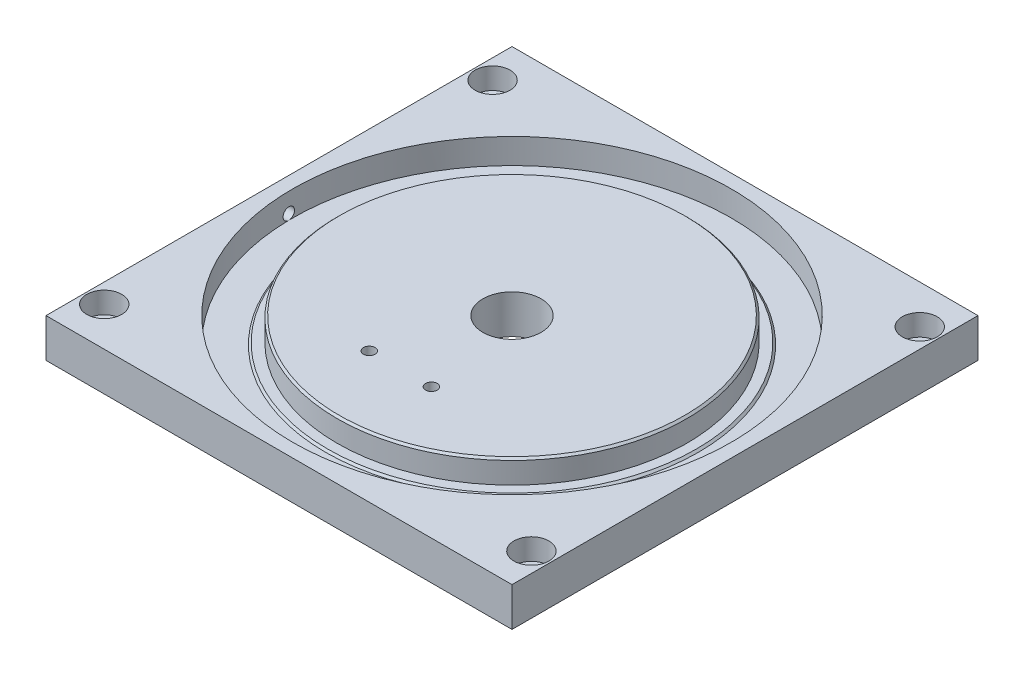
ISO-10303-21;
HEADER;
FILE_DESCRIPTION(('STEP AP214'),'2;1');
FILE_NAME('part.step','',(''),(''),'','','');
FILE_SCHEMA(('AUTOMOTIVE_DESIGN { 1 0 10303 214 1 1 1 1 }'));
ENDSEC;
DATA;
#1=APPLICATION_CONTEXT('core data for automotive mechanical design processes');
#2=APPLICATION_PROTOCOL_DEFINITION('international standard','automotive_design',2000,#1);
#3=PRODUCT_CONTEXT('',#1,'mechanical');
#4=PRODUCT('Part','Part','',(#3));
#5=PRODUCT_RELATED_PRODUCT_CATEGORY('part','',(#4));
#6=PRODUCT_DEFINITION_FORMATION('','',#4);
#7=PRODUCT_DEFINITION_CONTEXT('part definition',#1,'design');
#8=PRODUCT_DEFINITION('design','',#6,#7);
#9=PRODUCT_DEFINITION_SHAPE('','',#8);
#10=(LENGTH_UNIT() NAMED_UNIT(*) SI_UNIT(.MILLI.,.METRE.));
#11=(NAMED_UNIT(*) PLANE_ANGLE_UNIT() SI_UNIT($,.RADIAN.));
#12=(NAMED_UNIT(*) SI_UNIT($,.STERADIAN.) SOLID_ANGLE_UNIT());
#13=UNCERTAINTY_MEASURE_WITH_UNIT(LENGTH_MEASURE(1.E-05),#10,'distance_accuracy_value','');
#14=(GEOMETRIC_REPRESENTATION_CONTEXT(3) GLOBAL_UNCERTAINTY_ASSIGNED_CONTEXT((#13)) GLOBAL_UNIT_ASSIGNED_CONTEXT((#10,
#11,#12)) REPRESENTATION_CONTEXT('',''));
#15=CARTESIAN_POINT('',(0.,0.,0.));
#16=DIRECTION('',(0.,0.,1.));
#17=DIRECTION('',(1.,0.,0.));
#18=AXIS2_PLACEMENT_3D('',#15,#16,#17);
#19=CARTESIAN_POINT('',(120.,20.,120.));
#20=DIRECTION('',(-1.,0.,0.));
#21=DIRECTION('',(0.,0.,1.));
#22=AXIS2_PLACEMENT_3D('',#19,#20,#21);
#23=PLANE('',#22);
#24=DIRECTION('',(0.,0.,-1.));
#25=VECTOR('',#24,1.);
#26=CARTESIAN_POINT('',(120.,0.,120.));
#27=LINE('',#26,#25);
#28=CARTESIAN_POINT('',(120.,0.,120.));
#29=VERTEX_POINT('',#28);
#30=CARTESIAN_POINT('',(120.,0.,-120.));
#31=VERTEX_POINT('',#30);
#32=EDGE_CURVE('E170',#29,#31,#27,.T.);
#33=ORIENTED_EDGE('',*,*,#32,.T.);
#34=DIRECTION('',(0.,-1.,0.));
#35=VECTOR('',#34,1.);
#36=CARTESIAN_POINT('',(120.,20.,-120.));
#37=LINE('',#36,#35);
#38=CARTESIAN_POINT('',(120.,20.,-120.));
#39=VERTEX_POINT('',#38);
#40=EDGE_CURVE('E191',#39,#31,#37,.T.);
#41=ORIENTED_EDGE('',*,*,#40,.F.);
#42=DIRECTION('',(0.,0.,-1.));
#43=VECTOR('',#42,1.);
#44=CARTESIAN_POINT('',(120.,20.,120.));
#45=LINE('',#44,#43);
#46=CARTESIAN_POINT('',(120.,20.,120.));
#47=VERTEX_POINT('',#46);
#48=EDGE_CURVE('E171',#47,#39,#45,.T.);
#49=ORIENTED_EDGE('',*,*,#48,.F.);
#50=DIRECTION('',(0.,-1.,0.));
#51=VECTOR('',#50,1.);
#52=CARTESIAN_POINT('',(120.,20.,120.));
#53=LINE('',#52,#51);
#54=EDGE_CURVE('E177',#47,#29,#53,.T.);
#55=ORIENTED_EDGE('',*,*,#54,.T.);
#56=EDGE_LOOP('',(#33,#41,#49,#55));
#57=FACE_BOUND('',#56,.T.);
#58=ADVANCED_FACE('F17',(#57),#23,.F.);
#59=CARTESIAN_POINT('',(-120.,20.,-120.));
#60=DIRECTION('',(0.,0.,1.));
#61=DIRECTION('',(1.,0.,0.));
#62=AXIS2_PLACEMENT_3D('',#59,#60,#61);
#63=PLANE('',#62);
#64=DIRECTION('',(-1.,0.,0.));
#65=VECTOR('',#64,1.);
#66=CARTESIAN_POINT('',(-120.,0.,-120.));
#67=LINE('',#66,#65);
#68=CARTESIAN_POINT('',(-120.,0.,-120.));
#69=VERTEX_POINT('',#68);
#70=EDGE_CURVE('E180',#31,#69,#67,.T.);
#71=ORIENTED_EDGE('',*,*,#70,.T.);
#72=DIRECTION('',(0.,-1.,0.));
#73=VECTOR('',#72,1.);
#74=CARTESIAN_POINT('',(-120.,20.,-120.));
#75=LINE('',#74,#73);
#76=CARTESIAN_POINT('',(-120.,20.,-120.));
#77=VERTEX_POINT('',#76);
#78=EDGE_CURVE('E188',#77,#69,#75,.T.);
#79=ORIENTED_EDGE('',*,*,#78,.F.);
#80=DIRECTION('',(-1.,0.,0.));
#81=VECTOR('',#80,1.);
#82=CARTESIAN_POINT('',(-120.,20.,-120.));
#83=LINE('',#82,#81);
#84=EDGE_CURVE('E71',#39,#77,#83,.T.);
#85=ORIENTED_EDGE('',*,*,#84,.F.);
#86=ORIENTED_EDGE('',*,*,#40,.T.);
#87=EDGE_LOOP('',(#71,#79,#85,#86));
#88=FACE_BOUND('',#87,.T.);
#89=ADVANCED_FACE('F232',(#88),#63,.F.);
#90=CARTESIAN_POINT('',(-120.,20.,120.));
#91=DIRECTION('',(1.,0.,0.));
#92=DIRECTION('',(0.,0.,-1.));
#93=AXIS2_PLACEMENT_3D('',#90,#91,#92);
#94=PLANE('',#93);
#95=CARTESIAN_POINT('',(-120.,10.,1.99999999999968));
#96=DIRECTION('',(-1.,0.,0.));
#97=DIRECTION('',(0.,0.,1.));
#98=AXIS2_PLACEMENT_3D('',#95,#96,#97);
#99=CIRCLE('',#98,3.);
#100=CARTESIAN_POINT('',(-120.,10.,4.99999999999967));
#101=VERTEX_POINT('',#100);
#102=EDGE_CURVE('E509',#101,#101,#99,.T.);
#103=ORIENTED_EDGE('',*,*,#102,.F.);
#104=EDGE_LOOP('',(#103));
#105=FACE_BOUND('',#104,.T.);
#106=CARTESIAN_POINT('',(-120.,10.,66.));
#107=DIRECTION('',(-1.,0.,0.));
#108=DIRECTION('',(0.,0.,1.));
#109=AXIS2_PLACEMENT_3D('',#106,#107,#108);
#110=CIRCLE('',#109,3.);
#111=CARTESIAN_POINT('',(-120.,10.,69.));
#112=VERTEX_POINT('',#111);
#113=EDGE_CURVE('E511',#112,#112,#110,.T.);
#114=ORIENTED_EDGE('',*,*,#113,.F.);
#115=EDGE_LOOP('',(#114));
#116=FACE_BOUND('',#115,.T.);
#117=DIRECTION('',(0.,0.,1.));
#118=VECTOR('',#117,1.);
#119=CARTESIAN_POINT('',(-120.,0.,120.));
#120=LINE('',#119,#118);
#121=CARTESIAN_POINT('',(-120.,0.,120.));
#122=VERTEX_POINT('',#121);
#123=EDGE_CURVE('E182',#69,#122,#120,.T.);
#124=ORIENTED_EDGE('',*,*,#123,.T.);
#125=DIRECTION('',(0.,-1.,0.));
#126=VECTOR('',#125,1.);
#127=CARTESIAN_POINT('',(-120.,20.,120.));
#128=LINE('',#127,#126);
#129=CARTESIAN_POINT('',(-120.,20.,120.));
#130=VERTEX_POINT('',#129);
#131=EDGE_CURVE('E186',#130,#122,#128,.T.);
#132=ORIENTED_EDGE('',*,*,#131,.F.);
#133=DIRECTION('',(0.,0.,1.));
#134=VECTOR('',#133,1.);
#135=CARTESIAN_POINT('',(-120.,20.,120.));
#136=LINE('',#135,#134);
#137=EDGE_CURVE('E174',#77,#130,#136,.T.);
#138=ORIENTED_EDGE('',*,*,#137,.F.);
#139=ORIENTED_EDGE('',*,*,#78,.T.);
#140=EDGE_LOOP('',(#124,#132,#138,#139));
#141=FACE_BOUND('',#140,.T.);
#142=ADVANCED_FACE('F239',(#105,#116,#141),#94,.F.);
#143=CARTESIAN_POINT('',(-120.,20.,120.));
#144=DIRECTION('',(0.,0.,-1.));
#145=DIRECTION('',(-1.,0.,0.));
#146=AXIS2_PLACEMENT_3D('',#143,#144,#145);
#147=PLANE('',#146);
#148=DIRECTION('',(1.,0.,0.));
#149=VECTOR('',#148,1.);
#150=CARTESIAN_POINT('',(-120.,0.,120.));
#151=LINE('',#150,#149);
#152=EDGE_CURVE('E63',#122,#29,#151,.T.);
#153=ORIENTED_EDGE('',*,*,#152,.T.);
#154=ORIENTED_EDGE('',*,*,#54,.F.);
#155=DIRECTION('',(1.,0.,0.));
#156=VECTOR('',#155,1.);
#157=CARTESIAN_POINT('',(-120.,20.,120.));
#158=LINE('',#157,#156);
#159=EDGE_CURVE('E42',#130,#47,#158,.T.);
#160=ORIENTED_EDGE('',*,*,#159,.F.);
#161=ORIENTED_EDGE('',*,*,#131,.T.);
#162=EDGE_LOOP('',(#153,#154,#160,#161));
#163=FACE_BOUND('',#162,.T.);
#164=ADVANCED_FACE('F229',(#163),#147,.F.);
#165=CARTESIAN_POINT('',(0.,20.,0.));
#166=DIRECTION('',(0.,-1.,0.));
#167=DIRECTION('',(0.,0.,-1.));
#168=AXIS2_PLACEMENT_3D('',#165,#166,#167);
#169=PLANE('',#168);
#170=CARTESIAN_POINT('',(-110.,20.,-100.));
#171=DIRECTION('',(0.,1.,0.));
#172=DIRECTION('',(0.,0.,1.));
#173=AXIS2_PLACEMENT_3D('',#170,#171,#172);
#174=CIRCLE('',#173,9.);
#175=CARTESIAN_POINT('',(-110.,20.,-91.));
#176=VERTEX_POINT('',#175);
#177=EDGE_CURVE('E104',#176,#176,#174,.T.);
#178=ORIENTED_EDGE('',*,*,#177,.F.);
#179=EDGE_LOOP('',(#178));
#180=FACE_BOUND('',#179,.T.);
#181=CARTESIAN_POINT('',(110.,20.,-100.));
#182=DIRECTION('',(0.,1.,0.));
#183=DIRECTION('',(0.,0.,1.));
#184=AXIS2_PLACEMENT_3D('',#181,#182,#183);
#185=CIRCLE('',#184,9.);
#186=CARTESIAN_POINT('',(110.,20.,-91.));
#187=VERTEX_POINT('',#186);
#188=EDGE_CURVE('E116',#187,#187,#185,.T.);
#189=ORIENTED_EDGE('',*,*,#188,.F.);
#190=EDGE_LOOP('',(#189));
#191=FACE_BOUND('',#190,.T.);
#192=CARTESIAN_POINT('',(110.,20.,100.));
#193=DIRECTION('',(0.,1.,0.));
#194=DIRECTION('',(0.,0.,1.));
#195=AXIS2_PLACEMENT_3D('',#192,#193,#194);
#196=CIRCLE('',#195,9.);
#197=CARTESIAN_POINT('',(110.,20.,109.));
#198=VERTEX_POINT('',#197);
#199=EDGE_CURVE('E128',#198,#198,#196,.T.);
#200=ORIENTED_EDGE('',*,*,#199,.F.);
#201=EDGE_LOOP('',(#200));
#202=FACE_BOUND('',#201,.T.);
#203=CARTESIAN_POINT('',(-110.,20.,100.));
#204=DIRECTION('',(0.,1.,0.));
#205=DIRECTION('',(0.,0.,1.));
#206=AXIS2_PLACEMENT_3D('',#203,#204,#205);
#207=CIRCLE('',#206,9.);
#208=CARTESIAN_POINT('',(-110.,20.,109.));
#209=VERTEX_POINT('',#208);
#210=EDGE_CURVE('E140',#209,#209,#207,.T.);
#211=ORIENTED_EDGE('',*,*,#210,.F.);
#212=EDGE_LOOP('',(#211));
#213=FACE_BOUND('',#212,.T.);
#214=CARTESIAN_POINT('',(0.,20.,0.));
#215=DIRECTION('',(0.,1.,0.));
#216=DIRECTION('',(0.,0.,1.));
#217=AXIS2_PLACEMENT_3D('',#214,#215,#216);
#218=CIRCLE('',#217,113.);
#219=CARTESIAN_POINT('',(0.,20.,113.));
#220=VERTEX_POINT('',#219);
#221=EDGE_CURVE('E167',#220,#220,#218,.T.);
#222=ORIENTED_EDGE('',*,*,#221,.F.);
#223=EDGE_LOOP('',(#222));
#224=FACE_BOUND('',#223,.T.);
#225=ORIENTED_EDGE('',*,*,#48,.T.);
#226=ORIENTED_EDGE('',*,*,#84,.T.);
#227=ORIENTED_EDGE('',*,*,#137,.T.);
#228=ORIENTED_EDGE('',*,*,#159,.T.);
#229=EDGE_LOOP('',(#225,#226,#227,#228));
#230=FACE_BOUND('',#229,.T.);
#231=ADVANCED_FACE('F213',(#180,#191,#202,#213,#224,#230),#169,.F.);
#232=CARTESIAN_POINT('',(0.,0.,0.));
#233=DIRECTION('',(0.,-1.,0.));
#234=DIRECTION('',(0.,0.,-1.));
#235=AXIS2_PLACEMENT_3D('',#232,#233,#234);
#236=PLANE('',#235);
#237=CARTESIAN_POINT('',(-21.,0.,52.5));
#238=DIRECTION('',(0.,1.,0.));
#239=DIRECTION('',(0.,0.,1.));
#240=AXIS2_PLACEMENT_3D('',#237,#238,#239);
#241=CIRCLE('',#240,3.);
#242=CARTESIAN_POINT('',(-21.,0.,55.5));
#243=VERTEX_POINT('',#242);
#244=EDGE_CURVE('E89',#243,#243,#241,.T.);
#245=ORIENTED_EDGE('',*,*,#244,.T.);
#246=EDGE_LOOP('',(#245));
#247=FACE_BOUND('',#246,.T.);
#248=CARTESIAN_POINT('',(11.,0.,52.5));
#249=DIRECTION('',(0.,1.,0.));
#250=DIRECTION('',(0.,0.,1.));
#251=AXIS2_PLACEMENT_3D('',#248,#249,#250);
#252=CIRCLE('',#251,3.);
#253=CARTESIAN_POINT('',(11.,0.,55.5));
#254=VERTEX_POINT('',#253);
#255=EDGE_CURVE('E101',#254,#254,#252,.T.);
#256=ORIENTED_EDGE('',*,*,#255,.T.);
#257=EDGE_LOOP('',(#256));
#258=FACE_BOUND('',#257,.T.);
#259=CARTESIAN_POINT('',(-110.,0.,-100.));
#260=DIRECTION('',(0.,1.,0.));
#261=DIRECTION('',(0.,0.,1.));
#262=AXIS2_PLACEMENT_3D('',#259,#260,#261);
#263=CIRCLE('',#262,5.5);
#264=CARTESIAN_POINT('',(-110.,0.,-94.5));
#265=VERTEX_POINT('',#264);
#266=EDGE_CURVE('E113',#265,#265,#263,.T.);
#267=ORIENTED_EDGE('',*,*,#266,.T.);
#268=EDGE_LOOP('',(#267));
#269=FACE_BOUND('',#268,.T.);
#270=CARTESIAN_POINT('',(110.,0.,-100.));
#271=DIRECTION('',(0.,1.,0.));
#272=DIRECTION('',(0.,0.,1.));
#273=AXIS2_PLACEMENT_3D('',#270,#271,#272);
#274=CIRCLE('',#273,5.5);
#275=CARTESIAN_POINT('',(110.,0.,-94.5));
#276=VERTEX_POINT('',#275);
#277=EDGE_CURVE('E125',#276,#276,#274,.T.);
#278=ORIENTED_EDGE('',*,*,#277,.T.);
#279=EDGE_LOOP('',(#278));
#280=FACE_BOUND('',#279,.T.);
#281=CARTESIAN_POINT('',(110.,0.,100.));
#282=DIRECTION('',(0.,1.,0.));
#283=DIRECTION('',(0.,0.,1.));
#284=AXIS2_PLACEMENT_3D('',#281,#282,#283);
#285=CIRCLE('',#284,5.5);
#286=CARTESIAN_POINT('',(110.,0.,105.5));
#287=VERTEX_POINT('',#286);
#288=EDGE_CURVE('E137',#287,#287,#285,.T.);
#289=ORIENTED_EDGE('',*,*,#288,.T.);
#290=EDGE_LOOP('',(#289));
#291=FACE_BOUND('',#290,.T.);
#292=CARTESIAN_POINT('',(-110.,0.,100.));
#293=DIRECTION('',(0.,1.,0.));
#294=DIRECTION('',(0.,0.,1.));
#295=AXIS2_PLACEMENT_3D('',#292,#293,#294);
#296=CIRCLE('',#295,5.5);
#297=CARTESIAN_POINT('',(-110.,0.,105.5));
#298=VERTEX_POINT('',#297);
#299=EDGE_CURVE('E149',#298,#298,#296,.T.);
#300=ORIENTED_EDGE('',*,*,#299,.T.);
#301=EDGE_LOOP('',(#300));
#302=FACE_BOUND('',#301,.T.);
#303=CARTESIAN_POINT('',(0.,0.,0.));
#304=DIRECTION('',(0.,1.,0.));
#305=DIRECTION('',(0.,0.,1.));
#306=AXIS2_PLACEMENT_3D('',#303,#304,#305);
#307=CIRCLE('',#306,15.);
#308=CARTESIAN_POINT('',(0.,0.,15.));
#309=VERTEX_POINT('',#308);
#310=EDGE_CURVE('E155',#309,#309,#307,.T.);
#311=ORIENTED_EDGE('',*,*,#310,.T.);
#312=EDGE_LOOP('',(#311));
#313=FACE_BOUND('',#312,.T.);
#314=ORIENTED_EDGE('',*,*,#32,.F.);
#315=ORIENTED_EDGE('',*,*,#152,.F.);
#316=ORIENTED_EDGE('',*,*,#123,.F.);
#317=ORIENTED_EDGE('',*,*,#70,.F.);
#318=EDGE_LOOP('',(#314,#315,#316,#317));
#319=FACE_BOUND('',#318,.T.);
#320=ADVANCED_FACE('F228',(#247,#258,#269,#280,#291,#302,#313,#319),#236,.T.);
#321=CARTESIAN_POINT('',(0.,8.,0.));
#322=DIRECTION('',(0.,1.,0.));
#323=DIRECTION('',(0.,0.,1.));
#324=AXIS2_PLACEMENT_3D('',#321,#322,#323);
#325=CYLINDRICAL_SURFACE('',#324,113.);
#326=ORIENTED_EDGE('',*,*,#221,.T.);
#327=EDGE_LOOP('',(#326));
#328=FACE_BOUND('',#327,.T.);
#329=CARTESIAN_POINT('',(0.,7.,0.));
#330=DIRECTION('',(0.,1.,0.));
#331=DIRECTION('',(0.,0.,1.));
#332=AXIS2_PLACEMENT_3D('',#329,#330,#331);
#333=CIRCLE('',#332,113.);
#334=CARTESIAN_POINT('',(-112.982299498638,7.,1.99999999999968));
#335=VERTEX_POINT('',#334);
#336=EDGE_CURVE('E161',#335,#335,#333,.T.);
#337=ORIENTED_EDGE('',*,*,#336,.F.);
#338=CARTESIAN_POINT('',(-112.982299498638,7.,1.99999999999968));
#339=CARTESIAN_POINT('',(-112.979315329979,7.00000746935465,2.16854870265326));
#340=CARTESIAN_POINT('',(-112.975948868233,7.01425201065978,2.33721241365912));
#341=CARTESIAN_POINT('',(-112.968577585117,7.07087126290878,2.66987915428091));
#342=CARTESIAN_POINT('',(-112.964572000831,7.11327978672724,2.83387633428664));
#343=CARTESIAN_POINT('',(-112.956133495036,7.22501281408586,3.15234352909571));
#344=CARTESIAN_POINT('',(-112.951700786525,7.29432395354569,3.30681823018074));
#345=CARTESIAN_POINT('',(-112.942676562475,7.4578762531336,3.60189236535771));
#346=CARTESIAN_POINT('',(-112.938085086217,7.5521112846353,3.74249519879979));
#347=CARTESIAN_POINT('',(-112.929047621104,7.762893716718,4.00594739331122));
#348=CARTESIAN_POINT('',(-112.924601694583,7.87945053426032,4.1287892229681));
#349=CARTESIAN_POINT('',(-112.916175088981,8.13155343848756,4.353164669547));
#350=CARTESIAN_POINT('',(-112.912194427773,8.26710025422449,4.45469746801216));
#351=CARTESIAN_POINT('',(-112.904996832929,8.55330860715342,4.63354389737112));
#352=CARTESIAN_POINT('',(-112.901779748529,8.70396715225097,4.71086231021994));
#353=CARTESIAN_POINT('',(-112.896356135831,9.01614498101051,4.83910267301162));
#354=CARTESIAN_POINT('',(-112.894149600382,9.17766418781309,4.89002480973506));
#355=CARTESIAN_POINT('',(-112.89092171984,9.5068382721245,4.96398802256666));
#356=CARTESIAN_POINT('',(-112.8898994131,9.67448805703744,4.98705172161564));
#357=CARTESIAN_POINT('',(-112.88911779607,10.0112827019749,5.00471429385124));
#358=CARTESIAN_POINT('',(-112.889358478099,10.1804275529011,4.99931334014233));
#359=CARTESIAN_POINT('',(-112.891083163788,10.5153034095071,4.96021335566551));
#360=CARTESIAN_POINT('',(-112.892566415816,10.6810364169336,4.92653143205547));
#361=CARTESIAN_POINT('',(-112.896658157475,11.0044928135602,4.83185299529428));
#362=CARTESIAN_POINT('',(-112.899266649871,11.1622161830721,4.7708564150056));
#363=CARTESIAN_POINT('',(-112.905406715342,11.4652296902493,4.6232633635403));
#364=CARTESIAN_POINT('',(-112.908938560917,11.6105161407126,4.53665933412703));
#365=CARTESIAN_POINT('',(-112.916656235107,11.8844927913197,4.34031847646551));
#366=CARTESIAN_POINT('',(-112.920842066844,12.0131829122069,4.2305815377515));
#367=CARTESIAN_POINT('',(-112.929563928769,12.2504304584116,3.9909822775126));
#368=CARTESIAN_POINT('',(-112.934100255047,12.3589705921597,3.8611028446415));
#369=CARTESIAN_POINT('',(-112.943202791225,12.5527090467694,3.58496783433854));
#370=CARTESIAN_POINT('',(-112.94776900122,12.6379072926768,3.43871220432233));
#371=CARTESIAN_POINT('',(-112.956637416231,12.7825810490726,3.13389467260827));
#372=CARTESIAN_POINT('',(-112.96093949409,12.8420442522538,2.97532692552564));
#373=CARTESIAN_POINT('',(-112.969029068854,12.9334961534289,2.65044459050149));
#374=CARTESIAN_POINT('',(-112.972816566573,12.9654848947973,2.48413001479051));
#375=CARTESIAN_POINT('',(-112.979697317621,13.0010677769312,2.14852251043876));
#376=CARTESIAN_POINT('',(-112.982790761642,13.0046697262664,1.97923041369022));
#377=CARTESIAN_POINT('',(-112.988188685434,12.9833901949797,1.64243325502801));
#378=CARTESIAN_POINT('',(-112.990493167555,12.9585087991743,1.47492818779449));
#379=CARTESIAN_POINT('',(-112.994302419228,12.8809848327799,1.14655299480694));
#380=CARTESIAN_POINT('',(-112.995807603207,12.8283566768857,0.985679470650875));
#381=CARTESIAN_POINT('',(-112.998090527286,12.6968395049523,0.675045609164273));
#382=CARTESIAN_POINT('',(-112.998868268142,12.6179505162154,0.525285260280049));
#383=CARTESIAN_POINT('',(-112.999832099687,12.4361663391948,0.241155893394909));
#384=CARTESIAN_POINT('',(-113.000018290727,12.3332752258176,0.106784268575034));
#385=CARTESIAN_POINT('',(-112.999978842202,12.1063994465021,-0.142783377094274));
#386=CARTESIAN_POINT('',(-112.999753202098,11.9824147530247,-0.257979372908231));
#387=CARTESIAN_POINT('',(-112.999087360935,11.716849183824,-0.465943395959386));
#388=CARTESIAN_POINT('',(-112.998647126428,11.5752655676289,-0.55870792356888));
#389=CARTESIAN_POINT('',(-112.997740169277,11.2785355533742,-0.71915330630145));
#390=CARTESIAN_POINT('',(-112.997273446648,11.1233891629921,-0.786834175623946));
#391=CARTESIAN_POINT('',(-112.996467105979,10.8039183943363,-0.895197642292413));
#392=CARTESIAN_POINT('',(-112.996127502081,10.6395929971586,-0.935877235913902));
#393=CARTESIAN_POINT('',(-112.995674503715,10.3064444467587,-0.989071131347551));
#394=CARTESIAN_POINT('',(-112.995561109602,10.1376212864702,-1.0015853889082));
#395=CARTESIAN_POINT('',(-112.995592003825,9.80027544507266,-0.998093201156508));
#396=CARTESIAN_POINT('',(-112.995736284231,9.63175275487714,-0.982087633466992));
#397=CARTESIAN_POINT('',(-112.996242345781,9.29978619197054,-0.922011872630812));
#398=CARTESIAN_POINT('',(-112.996604127406,9.13634233054572,-0.877941617123116));
#399=CARTESIAN_POINT('',(-112.997438614169,8.81917015973084,-0.762986570915444));
#400=CARTESIAN_POINT('',(-112.997911321407,8.66544203450813,-0.692101272098809));
#401=CARTESIAN_POINT('',(-112.998808503375,8.3720737251524,-0.525531057399503));
#402=CARTESIAN_POINT('',(-112.999232979963,8.23243299798554,-0.429847097950821));
#403=CARTESIAN_POINT('',(-112.999843036536,7.97120606039183,-0.216403390438604));
#404=CARTESIAN_POINT('',(-113.000028634283,7.84961850810591,-0.098645284579028));
#405=CARTESIAN_POINT('',(-112.99996417733,7.62790868527028,0.155646462266375));
#406=CARTESIAN_POINT('',(-112.999714015406,7.52779170453784,0.292184716646701));
#407=CARTESIAN_POINT('',(-112.998602356846,7.35187490631338,0.580166646269586));
#408=CARTESIAN_POINT('',(-112.997740638282,7.27608393096759,0.731615715295491));
#409=CARTESIAN_POINT('',(-112.99527643231,7.15108891661518,1.04496402674891));
#410=CARTESIAN_POINT('',(-112.993674833644,7.10185313301889,1.20685053160114));
#411=CARTESIAN_POINT('',(-112.990422941922,7.04443970076231,1.4748023463157));
#412=CARTESIAN_POINT('',(-112.989014279656,7.02779528351196,1.57913246145049));
#413=CARTESIAN_POINT('',(-112.985886877619,7.00557309660651,1.78896001950047));
#414=CARTESIAN_POINT('',(-112.984168137965,6.99999532280798,1.89445746197858));
#415=CARTESIAN_POINT('',(-112.982299498638,7.,1.99999999999968));
#416=B_SPLINE_CURVE_WITH_KNOTS('',3,(#338,#339,#340,#341,#342,#343,#344,#345,#346,#347,#348,
#349,#350,#351,#352,#353,#354,#355,#356,#357,#358,#359,#360,#361,#362,#363,#364,#365,#366,#367,
#368,#369,#370,#371,#372,#373,#374,#375,#376,#377,#378,#379,#380,#381,#382,#383,#384,#385,#386,
#387,#388,#389,#390,#391,#392,#393,#394,#395,#396,#397,#398,#399,#400,#401,#402,#403,#404,#405,
#406,#407,#408,#409,#410,#411,#412,#413,#414,#415),.UNSPECIFIED.,.T.,.F.,(4,2,2,2,2,2,2,2,2,2,2,
2,2,2,2,2,2,2,2,2,2,2,2,2,2,2,2,2,2,2,2,2,2,2,2,2,2,2,4),(0.,0.505339901878184,1.01128759987224,
1.51698428547581,2.02255673890365,2.52834295148245,3.03414858720918,3.53985427130867,
4.04555637697543,4.5508475415466,5.05613563325166,5.5611182962162,6.06610220039992,
6.57123530352653,7.07637081885172,7.58193782890436,8.08750646239062,8.59331660825437,
9.09912595558284,9.60479616124476,10.1104648611439,10.6158711200254,11.1212768534595,
11.6265968451422,12.1319174965595,12.6373169343855,13.1427160861133,13.648171450944,
14.1536276099123,14.6590682150617,15.1645099433274,15.6699612496581,16.1753930646584,
16.6807872930206,17.1863058953206,17.6920080386715,18.1971043084255,18.5135402995478,
18.8299761721939),.UNSPECIFIED.);
#417=EDGE_CURVE('E21',#335,#335,#416,.T.);
#418=ORIENTED_EDGE('',*,*,#417,.T.);
#419=EDGE_LOOP('',(#337,#418));
#420=FACE_BOUND('',#419,.T.);
#421=ADVANCED_FACE('F221',(#328,#420),#325,.F.);
#422=CARTESIAN_POINT('',(0.,7.,0.));
#423=DIRECTION('',(0.,1.,0.));
#424=DIRECTION('',(0.,0.,1.));
#425=AXIS2_PLACEMENT_3D('',#422,#423,#424);
#426=PLANE('',#425);
#427=ORIENTED_EDGE('',*,*,#336,.T.);
#428=EDGE_LOOP('',(#427));
#429=FACE_BOUND('',#428,.T.);
#430=CARTESIAN_POINT('',(0.,7.,0.));
#431=DIRECTION('',(0.,1.,0.));
#432=DIRECTION('',(0.,0.,1.));
#433=AXIS2_PLACEMENT_3D('',#430,#431,#432);
#434=CIRCLE('',#433,96.);
#435=CARTESIAN_POINT('',(0.,7.,96.));
#436=VERTEX_POINT('',#435);
#437=EDGE_CURVE('E158',#436,#436,#434,.T.);
#438=ORIENTED_EDGE('',*,*,#437,.F.);
#439=EDGE_LOOP('',(#438));
#440=FACE_BOUND('',#439,.T.);
#441=ADVANCED_FACE('F210',(#429,#440),#426,.T.);
#442=CARTESIAN_POINT('',(-21.,20.,52.5));
#443=DIRECTION('',(0.,1.,0.));
#444=DIRECTION('',(0.,0.,1.));
#445=AXIS2_PLACEMENT_3D('',#442,#443,#444);
#446=CIRCLE('',#445,3.);
#447=CARTESIAN_POINT('',(-21.,20.,55.5));
#448=VERTEX_POINT('',#447);
#449=EDGE_CURVE('E85',#448,#448,#446,.T.);
#450=ORIENTED_EDGE('',*,*,#449,.F.);
#451=EDGE_LOOP('',(#450));
#452=FACE_BOUND('',#451,.T.);
#453=CARTESIAN_POINT('',(11.,20.,52.5));
#454=DIRECTION('',(0.,1.,0.));
#455=DIRECTION('',(0.,0.,1.));
#456=AXIS2_PLACEMENT_3D('',#453,#454,#455);
#457=CIRCLE('',#456,3.);
#458=CARTESIAN_POINT('',(11.,20.,55.5));
#459=VERTEX_POINT('',#458);
#460=EDGE_CURVE('E98',#459,#459,#457,.T.);
#461=ORIENTED_EDGE('',*,*,#460,.F.);
#462=EDGE_LOOP('',(#461));
#463=FACE_BOUND('',#462,.T.);
#464=CARTESIAN_POINT('',(0.,20.,0.));
#465=DIRECTION('',(0.,1.,0.));
#466=DIRECTION('',(0.,0.,1.));
#467=AXIS2_PLACEMENT_3D('',#464,#465,#466);
#468=CIRCLE('',#467,15.);
#469=CARTESIAN_POINT('',(0.,20.,15.));
#470=VERTEX_POINT('',#469);
#471=EDGE_CURVE('E152',#470,#470,#468,.T.);
#472=ORIENTED_EDGE('',*,*,#471,.F.);
#473=EDGE_LOOP('',(#472));
#474=FACE_BOUND('',#473,.T.);
#475=CARTESIAN_POINT('',(0.,20.,0.));
#476=DIRECTION('',(0.,-1.,0.));
#477=DIRECTION('',(0.,0.,-1.));
#478=AXIS2_PLACEMENT_3D('',#475,#476,#477);
#479=CIRCLE('',#478,89.);
#480=CARTESIAN_POINT('',(0.,20.,-89.));
#481=VERTEX_POINT('',#480);
#482=EDGE_CURVE('E193',#481,#481,#479,.F.);
#483=ORIENTED_EDGE('',*,*,#482,.T.);
#484=EDGE_LOOP('',(#483));
#485=FACE_BOUND('',#484,.T.);
#486=ADVANCED_FACE('F208',(#452,#463,#474,#485),#169,.F.);
#487=CARTESIAN_POINT('',(0.,8.,0.));
#488=DIRECTION('',(0.,1.,0.));
#489=DIRECTION('',(0.,0.,1.));
#490=AXIS2_PLACEMENT_3D('',#487,#488,#489);
#491=CYLINDRICAL_SURFACE('',#490,90.);
#492=CARTESIAN_POINT('',(0.,19.,0.));
#493=DIRECTION('',(0.,-1.,0.));
#494=DIRECTION('',(0.,0.,-1.));
#495=AXIS2_PLACEMENT_3D('',#492,#493,#494);
#496=CIRCLE('',#495,90.);
#497=CARTESIAN_POINT('',(0.,19.,-90.));
#498=VERTEX_POINT('',#497);
#499=EDGE_CURVE('E30',#498,#498,#496,.T.);
#500=ORIENTED_EDGE('',*,*,#499,.T.);
#501=EDGE_LOOP('',(#500));
#502=FACE_BOUND('',#501,.T.);
#503=CARTESIAN_POINT('',(0.,8.,0.));
#504=DIRECTION('',(0.,1.,0.));
#505=DIRECTION('',(0.,0.,1.));
#506=AXIS2_PLACEMENT_3D('',#503,#504,#505);
#507=CIRCLE('',#506,90.);
#508=CARTESIAN_POINT('',(0.,8.,90.));
#509=VERTEX_POINT('',#508);
#510=EDGE_CURVE('E164',#509,#509,#507,.T.);
#511=ORIENTED_EDGE('',*,*,#510,.T.);
#512=EDGE_LOOP('',(#511));
#513=FACE_BOUND('',#512,.T.);
#514=ADVANCED_FACE('F199',(#502,#513),#491,.T.);
#515=CARTESIAN_POINT('',(0.,8.,0.));
#516=DIRECTION('',(0.,1.,0.));
#517=DIRECTION('',(0.,0.,1.));
#518=AXIS2_PLACEMENT_3D('',#515,#516,#517);
#519=PLANE('',#518);
#520=CARTESIAN_POINT('',(0.,8.,0.));
#521=DIRECTION('',(0.,1.,0.));
#522=DIRECTION('',(0.,0.,1.));
#523=AXIS2_PLACEMENT_3D('',#520,#521,#522);
#524=CIRCLE('',#523,95.);
#525=CARTESIAN_POINT('',(0.,8.,95.));
#526=VERTEX_POINT('',#525);
#527=EDGE_CURVE('E11',#526,#526,#524,.T.);
#528=ORIENTED_EDGE('',*,*,#527,.T.);
#529=EDGE_LOOP('',(#528));
#530=FACE_BOUND('',#529,.T.);
#531=ORIENTED_EDGE('',*,*,#510,.F.);
#532=EDGE_LOOP('',(#531));
#533=FACE_BOUND('',#532,.T.);
#534=ADVANCED_FACE('F205',(#530,#533),#519,.T.);
#535=CARTESIAN_POINT('',(0.,20.,0.));
#536=DIRECTION('',(0.,-1.,0.));
#537=DIRECTION('',(0.,0.,-1.));
#538=AXIS2_PLACEMENT_3D('',#535,#536,#537);
#539=CONICAL_SURFACE('',#538,89.,0.785398163397448);
#540=ORIENTED_EDGE('',*,*,#499,.F.);
#541=EDGE_LOOP('',(#540));
#542=FACE_BOUND('',#541,.T.);
#543=ORIENTED_EDGE('',*,*,#482,.F.);
#544=EDGE_LOOP('',(#543));
#545=FACE_BOUND('',#544,.T.);
#546=ADVANCED_FACE('F202',(#542,#545),#539,.T.);
#547=CARTESIAN_POINT('',(0.,8.,0.));
#548=DIRECTION('',(0.,-1.,0.));
#549=DIRECTION('',(0.,0.,-1.));
#550=AXIS2_PLACEMENT_3D('',#547,#548,#549);
#551=CONICAL_SURFACE('',#550,95.,0.785398163397455);
#552=ORIENTED_EDGE('',*,*,#437,.T.);
#553=EDGE_LOOP('',(#552));
#554=FACE_BOUND('',#553,.T.);
#555=ORIENTED_EDGE('',*,*,#527,.F.);
#556=EDGE_LOOP('',(#555));
#557=FACE_BOUND('',#556,.T.);
#558=ADVANCED_FACE('F19',(#554,#557),#551,.T.);
#559=CARTESIAN_POINT('',(0.,20.,0.));
#560=DIRECTION('',(0.,1.,0.));
#561=DIRECTION('',(0.,0.,1.));
#562=AXIS2_PLACEMENT_3D('',#559,#560,#561);
#563=CYLINDRICAL_SURFACE('',#562,15.);
#564=ORIENTED_EDGE('',*,*,#310,.F.);
#565=EDGE_LOOP('',(#564));
#566=FACE_BOUND('',#565,.T.);
#567=ORIENTED_EDGE('',*,*,#471,.T.);
#568=EDGE_LOOP('',(#567));
#569=FACE_BOUND('',#568,.T.);
#570=ADVANCED_FACE('F275',(#566,#569),#563,.F.);
#571=CARTESIAN_POINT('',(-110.,20.,100.));
#572=DIRECTION('',(0.,1.,0.));
#573=DIRECTION('',(0.,0.,1.));
#574=AXIS2_PLACEMENT_3D('',#571,#572,#573);
#575=CYLINDRICAL_SURFACE('',#574,5.5);
#576=ORIENTED_EDGE('',*,*,#299,.F.);
#577=EDGE_LOOP('',(#576));
#578=FACE_BOUND('',#577,.T.);
#579=CARTESIAN_POINT('',(-110.,9.,100.));
#580=DIRECTION('',(0.,1.,0.));
#581=DIRECTION('',(0.,0.,1.));
#582=AXIS2_PLACEMENT_3D('',#579,#580,#581);
#583=CIRCLE('',#582,5.5);
#584=CARTESIAN_POINT('',(-110.,9.,105.5));
#585=VERTEX_POINT('',#584);
#586=EDGE_CURVE('E146',#585,#585,#583,.T.);
#587=ORIENTED_EDGE('',*,*,#586,.T.);
#588=EDGE_LOOP('',(#587));
#589=FACE_BOUND('',#588,.T.);
#590=ADVANCED_FACE('F278',(#578,#589),#575,.F.);
#591=CARTESIAN_POINT('',(-104.5,9.,100.));
#592=DIRECTION('',(0.,-1.,0.));
#593=DIRECTION('',(0.,0.,-1.));
#594=AXIS2_PLACEMENT_3D('',#591,#592,#593);
#595=PLANE('',#594);
#596=ORIENTED_EDGE('',*,*,#586,.F.);
#597=EDGE_LOOP('',(#596));
#598=FACE_BOUND('',#597,.T.);
#599=CARTESIAN_POINT('',(-110.,9.,100.));
#600=DIRECTION('',(0.,1.,0.));
#601=DIRECTION('',(0.,0.,1.));
#602=AXIS2_PLACEMENT_3D('',#599,#600,#601);
#603=CIRCLE('',#602,9.);
#604=CARTESIAN_POINT('',(-110.,9.,109.));
#605=VERTEX_POINT('',#604);
#606=EDGE_CURVE('E143',#605,#605,#603,.T.);
#607=ORIENTED_EDGE('',*,*,#606,.T.);
#608=EDGE_LOOP('',(#607));
#609=FACE_BOUND('',#608,.T.);
#610=ADVANCED_FACE('F287',(#598,#609),#595,.F.);
#611=CARTESIAN_POINT('',(-110.,20.,100.));
#612=DIRECTION('',(0.,1.,0.));
#613=DIRECTION('',(0.,0.,1.));
#614=AXIS2_PLACEMENT_3D('',#611,#612,#613);
#615=CYLINDRICAL_SURFACE('',#614,9.);
#616=ORIENTED_EDGE('',*,*,#606,.F.);
#617=EDGE_LOOP('',(#616));
#618=FACE_BOUND('',#617,.T.);
#619=ORIENTED_EDGE('',*,*,#210,.T.);
#620=EDGE_LOOP('',(#619));
#621=FACE_BOUND('',#620,.T.);
#622=ADVANCED_FACE('F339',(#618,#621),#615,.F.);
#623=CARTESIAN_POINT('',(110.,20.,100.));
#624=DIRECTION('',(0.,1.,0.));
#625=DIRECTION('',(0.,0.,1.));
#626=AXIS2_PLACEMENT_3D('',#623,#624,#625);
#627=CYLINDRICAL_SURFACE('',#626,5.5);
#628=ORIENTED_EDGE('',*,*,#288,.F.);
#629=EDGE_LOOP('',(#628));
#630=FACE_BOUND('',#629,.T.);
#631=CARTESIAN_POINT('',(110.,9.,100.));
#632=DIRECTION('',(0.,1.,0.));
#633=DIRECTION('',(0.,0.,1.));
#634=AXIS2_PLACEMENT_3D('',#631,#632,#633);
#635=CIRCLE('',#634,5.5);
#636=CARTESIAN_POINT('',(110.,9.,105.5));
#637=VERTEX_POINT('',#636);
#638=EDGE_CURVE('E134',#637,#637,#635,.T.);
#639=ORIENTED_EDGE('',*,*,#638,.T.);
#640=EDGE_LOOP('',(#639));
#641=FACE_BOUND('',#640,.T.);
#642=ADVANCED_FACE('F348',(#630,#641),#627,.F.);
#643=CARTESIAN_POINT('',(115.5,9.,100.));
#644=DIRECTION('',(0.,-1.,0.));
#645=DIRECTION('',(0.,0.,-1.));
#646=AXIS2_PLACEMENT_3D('',#643,#644,#645);
#647=PLANE('',#646);
#648=ORIENTED_EDGE('',*,*,#638,.F.);
#649=EDGE_LOOP('',(#648));
#650=FACE_BOUND('',#649,.T.);
#651=CARTESIAN_POINT('',(110.,9.,100.));
#652=DIRECTION('',(0.,1.,0.));
#653=DIRECTION('',(0.,0.,1.));
#654=AXIS2_PLACEMENT_3D('',#651,#652,#653);
#655=CIRCLE('',#654,9.);
#656=CARTESIAN_POINT('',(110.,9.,109.));
#657=VERTEX_POINT('',#656);
#658=EDGE_CURVE('E131',#657,#657,#655,.T.);
#659=ORIENTED_EDGE('',*,*,#658,.T.);
#660=EDGE_LOOP('',(#659));
#661=FACE_BOUND('',#660,.T.);
#662=ADVANCED_FACE('F358',(#650,#661),#647,.F.);
#663=CARTESIAN_POINT('',(110.,20.,100.));
#664=DIRECTION('',(0.,1.,0.));
#665=DIRECTION('',(0.,0.,1.));
#666=AXIS2_PLACEMENT_3D('',#663,#664,#665);
#667=CYLINDRICAL_SURFACE('',#666,9.);
#668=ORIENTED_EDGE('',*,*,#658,.F.);
#669=EDGE_LOOP('',(#668));
#670=FACE_BOUND('',#669,.T.);
#671=ORIENTED_EDGE('',*,*,#199,.T.);
#672=EDGE_LOOP('',(#671));
#673=FACE_BOUND('',#672,.T.);
#674=ADVANCED_FACE('F368',(#670,#673),#667,.F.);
#675=CARTESIAN_POINT('',(110.,20.,-100.));
#676=DIRECTION('',(0.,1.,0.));
#677=DIRECTION('',(0.,0.,1.));
#678=AXIS2_PLACEMENT_3D('',#675,#676,#677);
#679=CYLINDRICAL_SURFACE('',#678,5.5);
#680=ORIENTED_EDGE('',*,*,#277,.F.);
#681=EDGE_LOOP('',(#680));
#682=FACE_BOUND('',#681,.T.);
#683=CARTESIAN_POINT('',(110.,9.,-100.));
#684=DIRECTION('',(0.,1.,0.));
#685=DIRECTION('',(0.,0.,1.));
#686=AXIS2_PLACEMENT_3D('',#683,#684,#685);
#687=CIRCLE('',#686,5.5);
#688=CARTESIAN_POINT('',(110.,9.,-94.5));
#689=VERTEX_POINT('',#688);
#690=EDGE_CURVE('E122',#689,#689,#687,.T.);
#691=ORIENTED_EDGE('',*,*,#690,.T.);
#692=EDGE_LOOP('',(#691));
#693=FACE_BOUND('',#692,.T.);
#694=ADVANCED_FACE('F378',(#682,#693),#679,.F.);
#695=CARTESIAN_POINT('',(115.5,9.,-100.));
#696=DIRECTION('',(0.,-1.,0.));
#697=DIRECTION('',(0.,0.,-1.));
#698=AXIS2_PLACEMENT_3D('',#695,#696,#697);
#699=PLANE('',#698);
#700=ORIENTED_EDGE('',*,*,#690,.F.);
#701=EDGE_LOOP('',(#700));
#702=FACE_BOUND('',#701,.T.);
#703=CARTESIAN_POINT('',(110.,9.,-100.));
#704=DIRECTION('',(0.,1.,0.));
#705=DIRECTION('',(0.,0.,1.));
#706=AXIS2_PLACEMENT_3D('',#703,#704,#705);
#707=CIRCLE('',#706,9.);
#708=CARTESIAN_POINT('',(110.,9.,-91.));
#709=VERTEX_POINT('',#708);
#710=EDGE_CURVE('E119',#709,#709,#707,.T.);
#711=ORIENTED_EDGE('',*,*,#710,.T.);
#712=EDGE_LOOP('',(#711));
#713=FACE_BOUND('',#712,.T.);
#714=ADVANCED_FACE('F388',(#702,#713),#699,.F.);
#715=CARTESIAN_POINT('',(110.,20.,-100.));
#716=DIRECTION('',(0.,1.,0.));
#717=DIRECTION('',(0.,0.,1.));
#718=AXIS2_PLACEMENT_3D('',#715,#716,#717);
#719=CYLINDRICAL_SURFACE('',#718,9.);
#720=ORIENTED_EDGE('',*,*,#710,.F.);
#721=EDGE_LOOP('',(#720));
#722=FACE_BOUND('',#721,.T.);
#723=ORIENTED_EDGE('',*,*,#188,.T.);
#724=EDGE_LOOP('',(#723));
#725=FACE_BOUND('',#724,.T.);
#726=ADVANCED_FACE('F398',(#722,#725),#719,.F.);
#727=CARTESIAN_POINT('',(-110.,20.,-100.));
#728=DIRECTION('',(0.,1.,0.));
#729=DIRECTION('',(0.,0.,1.));
#730=AXIS2_PLACEMENT_3D('',#727,#728,#729);
#731=CYLINDRICAL_SURFACE('',#730,5.5);
#732=ORIENTED_EDGE('',*,*,#266,.F.);
#733=EDGE_LOOP('',(#732));
#734=FACE_BOUND('',#733,.T.);
#735=CARTESIAN_POINT('',(-110.,9.,-100.));
#736=DIRECTION('',(0.,1.,0.));
#737=DIRECTION('',(0.,0.,1.));
#738=AXIS2_PLACEMENT_3D('',#735,#736,#737);
#739=CIRCLE('',#738,5.5);
#740=CARTESIAN_POINT('',(-110.,9.,-94.5));
#741=VERTEX_POINT('',#740);
#742=EDGE_CURVE('E110',#741,#741,#739,.T.);
#743=ORIENTED_EDGE('',*,*,#742,.T.);
#744=EDGE_LOOP('',(#743));
#745=FACE_BOUND('',#744,.T.);
#746=ADVANCED_FACE('F408',(#734,#745),#731,.F.);
#747=CARTESIAN_POINT('',(-104.5,9.,-100.));
#748=DIRECTION('',(0.,-1.,0.));
#749=DIRECTION('',(0.,0.,-1.));
#750=AXIS2_PLACEMENT_3D('',#747,#748,#749);
#751=PLANE('',#750);
#752=ORIENTED_EDGE('',*,*,#742,.F.);
#753=EDGE_LOOP('',(#752));
#754=FACE_BOUND('',#753,.T.);
#755=CARTESIAN_POINT('',(-110.,9.,-100.));
#756=DIRECTION('',(0.,1.,0.));
#757=DIRECTION('',(0.,0.,1.));
#758=AXIS2_PLACEMENT_3D('',#755,#756,#757);
#759=CIRCLE('',#758,9.);
#760=CARTESIAN_POINT('',(-110.,9.,-91.));
#761=VERTEX_POINT('',#760);
#762=EDGE_CURVE('E107',#761,#761,#759,.T.);
#763=ORIENTED_EDGE('',*,*,#762,.T.);
#764=EDGE_LOOP('',(#763));
#765=FACE_BOUND('',#764,.T.);
#766=ADVANCED_FACE('F418',(#754,#765),#751,.F.);
#767=CARTESIAN_POINT('',(-110.,20.,-100.));
#768=DIRECTION('',(0.,1.,0.));
#769=DIRECTION('',(0.,0.,1.));
#770=AXIS2_PLACEMENT_3D('',#767,#768,#769);
#771=CYLINDRICAL_SURFACE('',#770,9.);
#772=ORIENTED_EDGE('',*,*,#762,.F.);
#773=EDGE_LOOP('',(#772));
#774=FACE_BOUND('',#773,.T.);
#775=ORIENTED_EDGE('',*,*,#177,.T.);
#776=EDGE_LOOP('',(#775));
#777=FACE_BOUND('',#776,.T.);
#778=ADVANCED_FACE('F428',(#774,#777),#771,.F.);
#779=CARTESIAN_POINT('',(11.,20.,52.5));
#780=DIRECTION('',(0.,1.,0.));
#781=DIRECTION('',(0.,0.,1.));
#782=AXIS2_PLACEMENT_3D('',#779,#780,#781);
#783=CYLINDRICAL_SURFACE('',#782,3.);
#784=ORIENTED_EDGE('',*,*,#255,.F.);
#785=EDGE_LOOP('',(#784));
#786=FACE_BOUND('',#785,.T.);
#787=ORIENTED_EDGE('',*,*,#460,.T.);
#788=EDGE_LOOP('',(#787));
#789=FACE_BOUND('',#788,.T.);
#790=ADVANCED_FACE('F438',(#786,#789),#783,.F.);
#791=CARTESIAN_POINT('',(-21.,20.,52.5));
#792=DIRECTION('',(0.,1.,0.));
#793=DIRECTION('',(0.,0.,1.));
#794=AXIS2_PLACEMENT_3D('',#791,#792,#793);
#795=CYLINDRICAL_SURFACE('',#794,3.);
#796=ORIENTED_EDGE('',*,*,#244,.F.);
#797=EDGE_LOOP('',(#796));
#798=FACE_BOUND('',#797,.T.);
#799=ORIENTED_EDGE('',*,*,#449,.T.);
#800=EDGE_LOOP('',(#799));
#801=FACE_BOUND('',#800,.T.);
#802=ADVANCED_FACE('F79',(#798,#801),#795,.F.);
#803=CARTESIAN_POINT('',(-97.,10.,66.));
#804=DIRECTION('',(-1.,0.,0.));
#805=DIRECTION('',(0.,0.,1.));
#806=AXIS2_PLACEMENT_3D('',#803,#804,#805);
#807=CONICAL_SURFACE('',#806,2.5,1.02974425867665);
#808=CARTESIAN_POINT('',(-95.497848452431,10.,66.));
#809=VERTEX_POINT('',#808);
#810=VERTEX_LOOP('',#809);
#811=FACE_BOUND('',#810,.T.);
#812=CARTESIAN_POINT('',(-97.,10.,66.));
#813=DIRECTION('',(-1.,0.,0.));
#814=DIRECTION('',(0.,0.,1.));
#815=AXIS2_PLACEMENT_3D('',#812,#813,#814);
#816=CIRCLE('',#815,2.5);
#817=CARTESIAN_POINT('',(-97.,10.,68.5));
#818=VERTEX_POINT('',#817);
#819=EDGE_CURVE('E83',#818,#818,#816,.T.);
#820=ORIENTED_EDGE('',*,*,#819,.T.);
#821=EDGE_LOOP('',(#820));
#822=FACE_BOUND('',#821,.T.);
#823=ADVANCED_FACE('F75',(#811,#822),#807,.F.);
#824=CARTESIAN_POINT('',(-120.,10.,66.));
#825=DIRECTION('',(-1.,0.,0.));
#826=DIRECTION('',(0.,0.,1.));
#827=AXIS2_PLACEMENT_3D('',#824,#825,#826);
#828=CYLINDRICAL_SURFACE('',#827,2.5);
#829=ORIENTED_EDGE('',*,*,#819,.F.);
#830=EDGE_LOOP('',(#829));
#831=FACE_BOUND('',#830,.T.);
#832=CARTESIAN_POINT('',(-102.,10.,66.));
#833=DIRECTION('',(-1.,0.,0.));
#834=DIRECTION('',(0.,0.,1.));
#835=AXIS2_PLACEMENT_3D('',#832,#833,#834);
#836=CIRCLE('',#835,2.5);
#837=CARTESIAN_POINT('',(-102.,10.,68.5));
#838=VERTEX_POINT('',#837);
#839=EDGE_CURVE('E86',#838,#838,#836,.T.);
#840=ORIENTED_EDGE('',*,*,#839,.T.);
#841=EDGE_LOOP('',(#840));
#842=FACE_BOUND('',#841,.T.);
#843=ADVANCED_FACE('F78',(#831,#842),#828,.F.);
#844=CARTESIAN_POINT('',(-102.,12.5,66.));
#845=DIRECTION('',(1.,0.,0.));
#846=DIRECTION('',(0.,0.,-1.));
#847=AXIS2_PLACEMENT_3D('',#844,#845,#846);
#848=PLANE('',#847);
#849=ORIENTED_EDGE('',*,*,#839,.F.);
#850=EDGE_LOOP('',(#849));
#851=FACE_BOUND('',#850,.T.);
#852=CARTESIAN_POINT('',(-102.,10.,66.));
#853=DIRECTION('',(-1.,0.,0.));
#854=DIRECTION('',(0.,0.,1.));
#855=AXIS2_PLACEMENT_3D('',#852,#853,#854);
#856=CIRCLE('',#855,3.);
#857=CARTESIAN_POINT('',(-102.,10.,69.));
#858=VERTEX_POINT('',#857);
#859=EDGE_CURVE('E92',#858,#858,#856,.T.);
#860=ORIENTED_EDGE('',*,*,#859,.T.);
#861=EDGE_LOOP('',(#860));
#862=FACE_BOUND('',#861,.T.);
#863=ADVANCED_FACE('F472',(#851,#862),#848,.F.);
#864=CARTESIAN_POINT('',(-120.,10.,66.));
#865=DIRECTION('',(-1.,0.,0.));
#866=DIRECTION('',(0.,0.,1.));
#867=AXIS2_PLACEMENT_3D('',#864,#865,#866);
#868=CYLINDRICAL_SURFACE('',#867,3.);
#869=ORIENTED_EDGE('',*,*,#859,.F.);
#870=EDGE_LOOP('',(#869));
#871=FACE_BOUND('',#870,.T.);
#872=ORIENTED_EDGE('',*,*,#113,.T.);
#873=EDGE_LOOP('',(#872));
#874=FACE_BOUND('',#873,.T.);
#875=ADVANCED_FACE('F481',(#871,#874),#868,.F.);
#876=CARTESIAN_POINT('',(-120.,10.,1.99999999999968));
#877=DIRECTION('',(-1.,0.,0.));
#878=DIRECTION('',(0.,0.,1.));
#879=AXIS2_PLACEMENT_3D('',#876,#877,#878);
#880=CYLINDRICAL_SURFACE('',#879,3.);
#881=ORIENTED_EDGE('',*,*,#102,.T.);
#882=EDGE_LOOP('',(#881));
#883=FACE_BOUND('',#882,.T.);
#884=ORIENTED_EDGE('',*,*,#417,.F.);
#885=EDGE_LOOP('',(#884));
#886=FACE_BOUND('',#885,.T.);
#887=ADVANCED_FACE('F491',(#883,#886),#880,.F.);
#888=CLOSED_SHELL('',(#58,#89,#142,#164,#231,#320,#421,#441,#486,#514,#534,#546,#558,#570,#590,
#610,#622,#642,#662,#674,#694,#714,#726,#746,#766,#778,#790,#802,#823,#843,#863,#875,#887));
#889=MANIFOLD_SOLID_BREP('B1',#888);
#890=ADVANCED_BREP_SHAPE_REPRESENTATION('',(#18,#889),#14);
#891=SHAPE_DEFINITION_REPRESENTATION(#9,#890);
ENDSEC;
END-ISO-10303-21;
